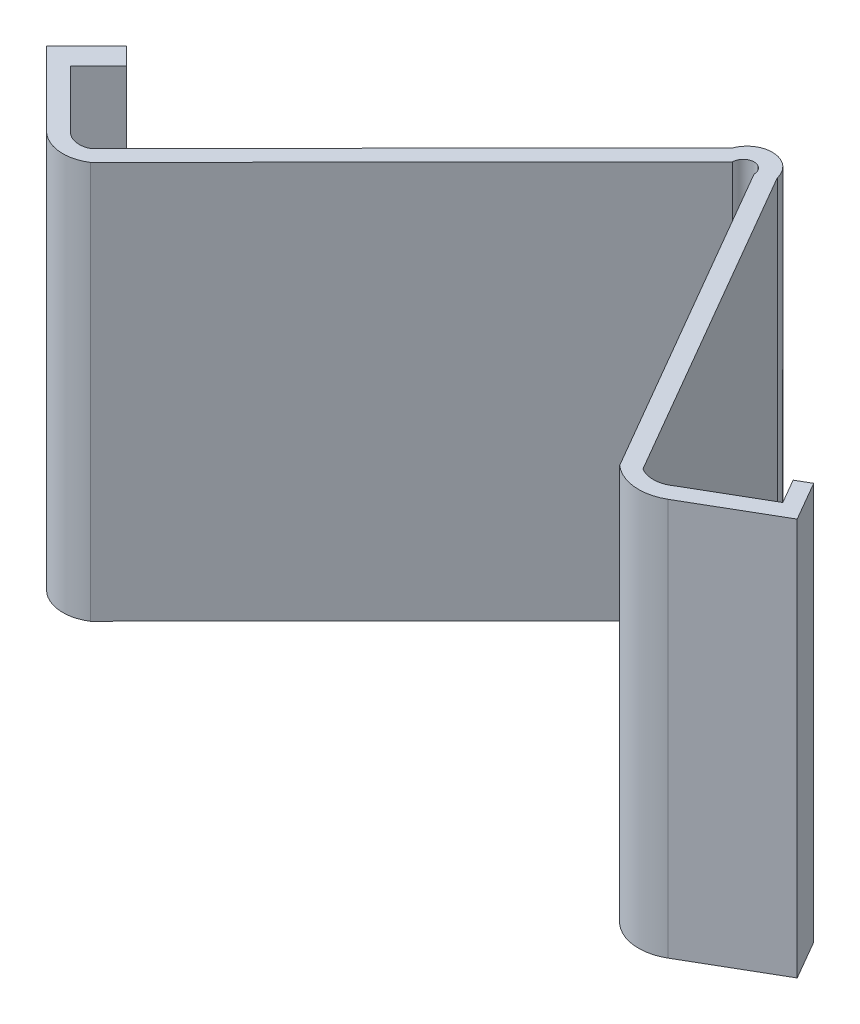
ISO-10303-21;
HEADER;
FILE_DESCRIPTION(('STEP AP214'),'2;1');
FILE_NAME('part.step','',(''),(''),'','','');
FILE_SCHEMA(('AUTOMOTIVE_DESIGN { 1 0 10303 214 1 1 1 1 }'));
ENDSEC;
DATA;
#1=APPLICATION_CONTEXT('core data for automotive mechanical design processes');
#2=APPLICATION_PROTOCOL_DEFINITION('international standard','automotive_design',2000,#1);
#3=PRODUCT_CONTEXT('',#1,'mechanical');
#4=PRODUCT('Part','Part','',(#3));
#5=PRODUCT_RELATED_PRODUCT_CATEGORY('part','',(#4));
#6=PRODUCT_DEFINITION_FORMATION('','',#4);
#7=PRODUCT_DEFINITION_CONTEXT('part definition',#1,'design');
#8=PRODUCT_DEFINITION('design','',#6,#7);
#9=PRODUCT_DEFINITION_SHAPE('','',#8);
#10=(LENGTH_UNIT() NAMED_UNIT(*) SI_UNIT(.MILLI.,.METRE.));
#11=(NAMED_UNIT(*) PLANE_ANGLE_UNIT() SI_UNIT($,.RADIAN.));
#12=(NAMED_UNIT(*) SI_UNIT($,.STERADIAN.) SOLID_ANGLE_UNIT());
#13=UNCERTAINTY_MEASURE_WITH_UNIT(LENGTH_MEASURE(1.E-05),#10,'distance_accuracy_value','');
#14=(GEOMETRIC_REPRESENTATION_CONTEXT(3) GLOBAL_UNCERTAINTY_ASSIGNED_CONTEXT((#13)) GLOBAL_UNIT_ASSIGNED_CONTEXT((#10,
#11,#12)) REPRESENTATION_CONTEXT('',''));
#15=CARTESIAN_POINT('',(0.,0.,0.));
#16=DIRECTION('',(0.,0.,1.));
#17=DIRECTION('',(1.,0.,0.));
#18=AXIS2_PLACEMENT_3D('',#15,#16,#17);
#19=CARTESIAN_POINT('',(-1.37972752963532,70.,-1.37563338266311));
#20=DIRECTION('',(-0.708156678158469,0.,-0.7060553230304));
#21=DIRECTION('',(-0.7060553230304,0.,0.708156678158469));
#22=AXIS2_PLACEMENT_3D('',#19,#20,#21);
#23=PLANE('',#22);
#24=DIRECTION('',(0.7060553230304,0.,-0.708156678158469));
#25=VECTOR('',#24,1.);
#26=CARTESIAN_POINT('',(-1.37972752963532,0.,-1.37563338266311));
#27=LINE('',#26,#25);
#28=CARTESIAN_POINT('',(-43.3633685392197,0.,40.73295893945));
#29=VERTEX_POINT('',#28);
#30=CARTESIAN_POINT('',(13.1210573032123,0.,-15.9195753132276));
#31=VERTEX_POINT('',#30);
#32=EDGE_CURVE('E578',#29,#31,#27,.T.);
#33=ORIENTED_EDGE('',*,*,#32,.T.);
#34=DIRECTION('',(0.,-1.,0.));
#35=VECTOR('',#34,1.);
#36=CARTESIAN_POINT('',(13.1210573032123,70.,-15.9195753132276));
#37=LINE('',#36,#35);
#38=CARTESIAN_POINT('',(13.1210573032123,70.,-15.9195753132276));
#39=VERTEX_POINT('',#38);
#40=EDGE_CURVE('E598',#39,#31,#37,.T.);
#41=ORIENTED_EDGE('',*,*,#40,.F.);
#42=DIRECTION('',(0.7060553230304,0.,-0.708156678158469));
#43=VECTOR('',#42,1.);
#44=CARTESIAN_POINT('',(-1.37972752963532,70.,-1.37563338266311));
#45=LINE('',#44,#43);
#46=CARTESIAN_POINT('',(-43.3633685392197,70.,40.73295893945));
#47=VERTEX_POINT('',#46);
#48=EDGE_CURVE('E587',#47,#39,#45,.T.);
#49=ORIENTED_EDGE('',*,*,#48,.F.);
#50=DIRECTION('',(0.,-1.,0.));
#51=VECTOR('',#50,1.);
#52=CARTESIAN_POINT('',(-43.3633685392197,70.,40.73295893945));
#53=LINE('',#52,#51);
#54=EDGE_CURVE('E330',#47,#29,#53,.T.);
#55=ORIENTED_EDGE('',*,*,#54,.T.);
#56=EDGE_LOOP('',(#33,#41,#49,#55));
#57=FACE_BOUND('',#56,.T.);
#58=ADVANCED_FACE('F311',(#57),#23,.F.);
#59=CARTESIAN_POINT('',(-3.50419756411074,70.,-3.49379935175431));
#60=DIRECTION('',(-0.708156678158469,0.,-0.7060553230304));
#61=DIRECTION('',(-0.7060553230304,0.,0.708156678158469));
#62=AXIS2_PLACEMENT_3D('',#59,#60,#61);
#63=PLANE('',#62);
#64=DIRECTION('',(0.7060553230304,0.,-0.708156678158469));
#65=VECTOR('',#64,1.);
#66=CARTESIAN_POINT('',(-3.50419756411074,0.,-3.49379935175431));
#67=LINE('',#66,#65);
#68=CARTESIAN_POINT('',(-45.4878385736951,0.,38.6147929703588));
#69=VERTEX_POINT('',#68);
#70=CARTESIAN_POINT('',(10.9965872687369,0.,-18.0377412823188));
#71=VERTEX_POINT('',#70);
#72=EDGE_CURVE('E576',#69,#71,#67,.T.);
#73=ORIENTED_EDGE('',*,*,#72,.F.);
#74=DIRECTION('',(0.,-1.,0.));
#75=VECTOR('',#74,1.);
#76=CARTESIAN_POINT('',(-45.4878385736951,70.,38.6147929703588));
#77=LINE('',#76,#75);
#78=CARTESIAN_POINT('',(-45.4878385736951,70.,38.6147929703588));
#79=VERTEX_POINT('',#78);
#80=EDGE_CURVE('E321',#79,#69,#77,.T.);
#81=ORIENTED_EDGE('',*,*,#80,.F.);
#82=DIRECTION('',(0.7060553230304,0.,-0.708156678158469));
#83=VECTOR('',#82,1.);
#84=CARTESIAN_POINT('',(-3.50419756411074,70.,-3.49379935175431));
#85=LINE('',#84,#83);
#86=CARTESIAN_POINT('',(10.9965872687369,70.,-18.0377412823188));
#87=VERTEX_POINT('',#86);
#88=EDGE_CURVE('E585',#79,#87,#85,.T.);
#89=ORIENTED_EDGE('',*,*,#88,.T.);
#90=DIRECTION('',(0.,-1.,0.));
#91=VECTOR('',#90,1.);
#92=CARTESIAN_POINT('',(10.9965872687369,70.,-18.0377412823188));
#93=LINE('',#92,#91);
#94=EDGE_CURVE('E12',#87,#71,#93,.T.);
#95=ORIENTED_EDGE('',*,*,#94,.T.);
#96=EDGE_LOOP('',(#73,#81,#89,#95));
#97=FACE_BOUND('',#96,.T.);
#98=ADVANCED_FACE('F653',(#97),#63,.T.);
#99=CARTESIAN_POINT('',(-47.1014105514273,70.,34.8767509581333));
#100=DIRECTION('',(0.,-1.,0.));
#101=DIRECTION('',(0.,0.,-1.));
#102=AXIS2_PLACEMENT_3D('',#99,#100,#101);
#103=CYLINDRICAL_SURFACE('',#102,6.94752689850618);
#104=CARTESIAN_POINT('',(-47.1014105514273,0.,34.8767509581333));
#105=DIRECTION('',(0.,1.,0.));
#106=DIRECTION('',(0.,0.,1.));
#107=AXIS2_PLACEMENT_3D('',#104,#105,#106);
#108=CIRCLE('',#107,6.94752689850618);
#109=CARTESIAN_POINT('',(-52.0067489000145,0.,39.7966885279961));
#110=VERTEX_POINT('',#109);
#111=EDGE_CURVE('E551',#29,#110,#108,.F.);
#112=ORIENTED_EDGE('',*,*,#111,.F.);
#113=ORIENTED_EDGE('',*,*,#54,.F.);
#114=CARTESIAN_POINT('',(-47.1014105514273,70.,34.8767509581333));
#115=DIRECTION('',(0.,1.,0.));
#116=DIRECTION('',(0.,0.,1.));
#117=AXIS2_PLACEMENT_3D('',#114,#115,#116);
#118=CIRCLE('',#117,6.94752689850618);
#119=CARTESIAN_POINT('',(-52.0067489000145,70.,39.7966885279961));
#120=VERTEX_POINT('',#119);
#121=EDGE_CURVE('E645',#47,#120,#118,.F.);
#122=ORIENTED_EDGE('',*,*,#121,.T.);
#123=DIRECTION('',(0.,-1.,0.));
#124=VECTOR('',#123,1.);
#125=CARTESIAN_POINT('',(-52.0067489000145,70.,39.7966885279961));
#126=LINE('',#125,#124);
#127=EDGE_CURVE('E556',#120,#110,#126,.T.);
#128=ORIENTED_EDGE('',*,*,#127,.T.);
#129=EDGE_LOOP('',(#112,#113,#122,#128));
#130=FACE_BOUND('',#129,.T.);
#131=ADVANCED_FACE('F683',(#130),#103,.T.);
#132=CARTESIAN_POINT('',(-47.0795581582017,70.,35.301794509272));
#133=DIRECTION('',(0.,-1.,0.));
#134=DIRECTION('',(0.,0.,-1.));
#135=AXIS2_PLACEMENT_3D('',#132,#133,#134);
#136=CYLINDRICAL_SURFACE('',#135,3.67553125940526);
#137=CARTESIAN_POINT('',(-47.0795581582017,0.,35.301794509272));
#138=DIRECTION('',(0.,1.,0.));
#139=DIRECTION('',(0.,0.,1.));
#140=AXIS2_PLACEMENT_3D('',#137,#138,#139);
#141=CIRCLE('',#140,3.67553125940526);
#142=CARTESIAN_POINT('',(-49.8885829309233,0.,37.6722184935206));
#143=VERTEX_POINT('',#142);
#144=EDGE_CURVE('E570',#143,#69,#141,.T.);
#145=ORIENTED_EDGE('',*,*,#144,.F.);
#146=DIRECTION('',(0.,-1.,0.));
#147=VECTOR('',#146,1.);
#148=CARTESIAN_POINT('',(-49.8885829309233,70.,37.6722184935206));
#149=LINE('',#148,#147);
#150=CARTESIAN_POINT('',(-49.8885829309233,70.,37.6722184935206));
#151=VERTEX_POINT('',#150);
#152=EDGE_CURVE('E567',#151,#143,#149,.T.);
#153=ORIENTED_EDGE('',*,*,#152,.F.);
#154=CARTESIAN_POINT('',(-47.0795581582017,70.,35.301794509272));
#155=DIRECTION('',(0.,1.,0.));
#156=DIRECTION('',(0.,0.,1.));
#157=AXIS2_PLACEMENT_3D('',#154,#155,#156);
#158=CIRCLE('',#157,3.67553125940526);
#159=EDGE_CURVE('E646',#151,#79,#158,.T.);
#160=ORIENTED_EDGE('',*,*,#159,.T.);
#161=ORIENTED_EDGE('',*,*,#80,.T.);
#162=EDGE_LOOP('',(#145,#153,#160,#161));
#163=FACE_BOUND('',#162,.T.);
#164=ADVANCED_FACE('F572',(#163),#136,.F.);
#165=CARTESIAN_POINT('',(0.,0.,0.));
#166=DIRECTION('',(0.,1.,0.));
#167=DIRECTION('',(0.,0.,1.));
#168=AXIS2_PLACEMENT_3D('',#165,#166,#167);
#169=PLANE('',#168);
#170=ORIENTED_EDGE('',*,*,#144,.T.);
#171=ORIENTED_EDGE('',*,*,#72,.T.);
#172=CARTESIAN_POINT('',(15.1528221863756,0.,-16.4480817857646));
#173=DIRECTION('',(0.,1.,0.));
#174=DIRECTION('',(0.,0.,1.));
#175=AXIS2_PLACEMENT_3D('',#172,#173,#174);
#176=CIRCLE('',#175,4.44986584130173);
#177=CARTESIAN_POINT('',(19.4944801510169,0.,-17.4234340932158));
#178=VERTEX_POINT('',#177);
#179=EDGE_CURVE('E595',#178,#71,#176,.T.);
#180=ORIENTED_EDGE('',*,*,#179,.F.);
#181=DIRECTION('',(0.501286259996058,0.,0.865281506527884));
#182=VECTOR('',#181,1.);
#183=CARTESIAN_POINT('',(22.1532324220866,0.,-12.83410190084));
#184=LINE('',#183,#182);
#185=CARTESIAN_POINT('',(52.0780870507607,0.,38.8198638310967));
#186=VERTEX_POINT('',#185);
#187=EDGE_CURVE('E613',#178,#186,#184,.T.);
#188=ORIENTED_EDGE('',*,*,#187,.T.);
#189=CARTESIAN_POINT('',(54.6049088930095,0.,34.700594649184));
#190=DIRECTION('',(0.,1.,0.));
#191=DIRECTION('',(0.,0.,1.));
#192=AXIS2_PLACEMENT_3D('',#189,#190,#191);
#193=CIRCLE('',#192,4.83251561979015);
#194=CARTESIAN_POINT('',(57.4000259774135,0.,38.6427422491584));
#195=VERTEX_POINT('',#194);
#196=EDGE_CURVE('E626',#186,#195,#193,.T.);
#197=ORIENTED_EDGE('',*,*,#196,.T.);
#198=DIRECTION('',(0.865281506527882,0.,-0.501286259996061));
#199=VECTOR('',#198,1.);
#200=CARTESIAN_POINT('',(57.4000259774135,0.,38.6427422491584));
#201=LINE('',#200,#199);
#202=CARTESIAN_POINT('',(69.5139670688039,0.,31.6247346092136));
#203=VERTEX_POINT('',#202);
#204=EDGE_CURVE('E456',#195,#203,#201,.T.);
#205=ORIENTED_EDGE('',*,*,#204,.T.);
#206=DIRECTION('',(-0.501286259996063,0.,-0.865281506527881));
#207=VECTOR('',#206,1.);
#208=CARTESIAN_POINT('',(71.0178258487921,0.,34.2205791287972));
#209=LINE('',#208,#207);
#210=CARTESIAN_POINT('',(67.0075357688236,0.,27.2983270765742));
#211=VERTEX_POINT('',#210);
#212=EDGE_CURVE('E440',#203,#211,#209,.T.);
#213=ORIENTED_EDGE('',*,*,#212,.T.);
#214=DIRECTION('',(0.865281506527881,0.,-0.501286259996062));
#215=VECTOR('',#214,1.);
#216=CARTESIAN_POINT('',(67.0075357688236,0.,27.2983270765742));
#217=LINE('',#216,#215);
#218=CARTESIAN_POINT('',(69.3043788078117,0.,25.9676897659115));
#219=VERTEX_POINT('',#218);
#220=EDGE_CURVE('E470',#211,#219,#217,.T.);
#221=ORIENTED_EDGE('',*,*,#220,.T.);
#222=DIRECTION('',(-0.501286259996063,0.,-0.865281506527881));
#223=VECTOR('',#222,1.);
#224=CARTESIAN_POINT('',(73.3146688877803,0.,32.8899418181347));
#225=LINE('',#224,#223);
#226=CARTESIAN_POINT('',(73.3146688877803,0.,32.8899418181347));
#227=VERTEX_POINT('',#226);
#228=EDGE_CURVE('E462',#227,#219,#225,.T.);
#229=ORIENTED_EDGE('',*,*,#228,.F.);
#230=DIRECTION('',(0.865281506527882,0.,-0.501286259996062));
#231=VECTOR('',#230,1.);
#232=CARTESIAN_POINT('',(58.9038847574017,0.,41.2385867687421));
#233=LINE('',#232,#231);
#234=CARTESIAN_POINT('',(58.9038847574017,0.,41.2385867687421));
#235=VERTEX_POINT('',#234);
#236=EDGE_CURVE('E446',#235,#227,#233,.T.);
#237=ORIENTED_EDGE('',*,*,#236,.F.);
#238=CARTESIAN_POINT('',(54.8312610227236,0.,34.2087391908511));
#239=DIRECTION('',(0.,1.,0.));
#240=DIRECTION('',(0.,0.,1.));
#241=AXIS2_PLACEMENT_3D('',#238,#239,#240);
#242=CIRCLE('',#241,8.1243474231868);
#243=CARTESIAN_POINT('',(49.4822425311771,0.,40.3237226110849));
#244=VERTEX_POINT('',#243);
#245=EDGE_CURVE('E624',#244,#235,#242,.T.);
#246=ORIENTED_EDGE('',*,*,#245,.F.);
#247=DIRECTION('',(0.501286259996058,0.,0.865281506527884));
#248=VECTOR('',#247,1.);
#249=CARTESIAN_POINT('',(19.5573879025029,0.,-11.3302431208518));
#250=LINE('',#249,#248);
#251=CARTESIAN_POINT('',(16.8986356314333,0.,-15.9195753132276));
#252=VERTEX_POINT('',#251);
#253=EDGE_CURVE('E558',#252,#244,#250,.T.);
#254=ORIENTED_EDGE('',*,*,#253,.F.);
#255=CARTESIAN_POINT('',(15.0098464673228,0.,-15.9195753132276));
#256=DIRECTION('',(0.,1.,0.));
#257=DIRECTION('',(0.,0.,1.));
#258=AXIS2_PLACEMENT_3D('',#255,#256,#257);
#259=CIRCLE('',#258,1.88878916411049);
#260=EDGE_CURVE('E599',#252,#31,#259,.T.);
#261=ORIENTED_EDGE('',*,*,#260,.T.);
#262=ORIENTED_EDGE('',*,*,#32,.F.);
#263=ORIENTED_EDGE('',*,*,#111,.T.);
#264=DIRECTION('',(-0.708156678158472,0.,-0.706055323030397));
#265=VECTOR('',#264,1.);
#266=CARTESIAN_POINT('',(-52.0067489000145,0.,39.796688527996));
#267=LINE('',#266,#265);
#268=CARTESIAN_POINT('',(-64.9802774574749,0.,26.861657087917));
#269=VERTEX_POINT('',#268);
#270=EDGE_CURVE('E549',#110,#269,#267,.T.);
#271=ORIENTED_EDGE('',*,*,#270,.T.);
#272=DIRECTION('',(0.706055323030396,0.,-0.708156678158473));
#273=VECTOR('',#272,1.);
#274=CARTESIAN_POINT('',(-64.9802774574749,0.,26.861657087917));
#275=LINE('',#274,#273);
#276=CARTESIAN_POINT('',(-57.9197242271709,0.,19.7800903063323));
#277=VERTEX_POINT('',#276);
#278=EDGE_CURVE('E482',#269,#277,#275,.T.);
#279=ORIENTED_EDGE('',*,*,#278,.T.);
#280=DIRECTION('',(-0.708156678158471,0.,-0.706055323030398));
#281=VECTOR('',#280,1.);
#282=CARTESIAN_POINT('',(-54.8603891639291,0.,22.8303472239858));
#283=LINE('',#282,#281);
#284=CARTESIAN_POINT('',(-54.8603891639291,0.,22.8303472239858));
#285=VERTEX_POINT('',#284);
#286=EDGE_CURVE('E478',#285,#277,#283,.T.);
#287=ORIENTED_EDGE('',*,*,#286,.F.);
#288=DIRECTION('',(0.706055323030397,0.,-0.708156678158472));
#289=VECTOR('',#288,1.);
#290=CARTESIAN_POINT('',(-61.9209423942331,0.,29.9119140055705));
#291=LINE('',#290,#289);
#292=CARTESIAN_POINT('',(-59.8027764251419,0.,27.7874439710951));
#293=VERTEX_POINT('',#292);
#294=EDGE_CURVE('E489',#293,#285,#291,.T.);
#295=ORIENTED_EDGE('',*,*,#294,.F.);
#296=DIRECTION('',(-0.708156678158472,0.,-0.706055323030397));
#297=VECTOR('',#296,1.);
#298=CARTESIAN_POINT('',(-49.8885829309233,0.,37.6722184935206));
#299=LINE('',#298,#297);
#300=EDGE_CURVE('E528',#143,#293,#299,.T.);
#301=ORIENTED_EDGE('',*,*,#300,.F.);
#302=EDGE_LOOP('',(#170,#171,#180,#188,#197,#205,#213,#221,#229,#237,#246,#254,#261,#262,#263,
#271,#279,#287,#295,#301));
#303=FACE_BOUND('',#302,.T.);
#304=ADVANCED_FACE('F468',(#303),#169,.F.);
#305=CARTESIAN_POINT('',(0.,70.,0.));
#306=DIRECTION('',(0.,1.,0.));
#307=DIRECTION('',(0.,0.,1.));
#308=AXIS2_PLACEMENT_3D('',#305,#306,#307);
#309=PLANE('',#308);
#310=ORIENTED_EDGE('',*,*,#121,.F.);
#311=ORIENTED_EDGE('',*,*,#48,.T.);
#312=CARTESIAN_POINT('',(15.0098464673228,70.,-15.9195753132276));
#313=DIRECTION('',(0.,1.,0.));
#314=DIRECTION('',(0.,0.,1.));
#315=AXIS2_PLACEMENT_3D('',#312,#313,#314);
#316=CIRCLE('',#315,1.88878916411049);
#317=CARTESIAN_POINT('',(16.8986356314333,70.,-15.9195753132276));
#318=VERTEX_POINT('',#317);
#319=EDGE_CURVE('E591',#318,#39,#316,.T.);
#320=ORIENTED_EDGE('',*,*,#319,.F.);
#321=DIRECTION('',(0.501286259996058,0.,0.865281506527884));
#322=VECTOR('',#321,1.);
#323=CARTESIAN_POINT('',(19.5573879025029,70.,-11.3302431208518));
#324=LINE('',#323,#322);
#325=CARTESIAN_POINT('',(49.4822425311771,70.,40.3237226110849));
#326=VERTEX_POINT('',#325);
#327=EDGE_CURVE('E611',#318,#326,#324,.T.);
#328=ORIENTED_EDGE('',*,*,#327,.T.);
#329=CARTESIAN_POINT('',(54.8312610227236,70.,34.2087391908511));
#330=DIRECTION('',(0.,1.,0.));
#331=DIRECTION('',(0.,0.,1.));
#332=AXIS2_PLACEMENT_3D('',#329,#330,#331);
#333=CIRCLE('',#332,8.1243474231868);
#334=CARTESIAN_POINT('',(58.9038847574017,70.,41.2385867687421));
#335=VERTEX_POINT('',#334);
#336=EDGE_CURVE('E518',#326,#335,#333,.T.);
#337=ORIENTED_EDGE('',*,*,#336,.T.);
#338=DIRECTION('',(0.865281506527882,0.,-0.501286259996062));
#339=VECTOR('',#338,1.);
#340=CARTESIAN_POINT('',(58.9038847574017,70.,41.2385867687421));
#341=LINE('',#340,#339);
#342=CARTESIAN_POINT('',(73.3146688877803,70.,32.8899418181347));
#343=VERTEX_POINT('',#342);
#344=EDGE_CURVE('E515',#335,#343,#341,.T.);
#345=ORIENTED_EDGE('',*,*,#344,.T.);
#346=DIRECTION('',(-0.501286259996063,0.,-0.865281506527881));
#347=VECTOR('',#346,1.);
#348=CARTESIAN_POINT('',(73.3146688877803,70.,32.8899418181347));
#349=LINE('',#348,#347);
#350=CARTESIAN_POINT('',(69.3043788078117,70.,25.9676897659115));
#351=VERTEX_POINT('',#350);
#352=EDGE_CURVE('E463',#343,#351,#349,.T.);
#353=ORIENTED_EDGE('',*,*,#352,.T.);
#354=DIRECTION('',(0.865281506527881,0.,-0.501286259996062));
#355=VECTOR('',#354,1.);
#356=CARTESIAN_POINT('',(67.0075357688236,70.,27.2983270765742));
#357=LINE('',#356,#355);
#358=CARTESIAN_POINT('',(67.0075357688236,70.,27.2983270765742));
#359=VERTEX_POINT('',#358);
#360=EDGE_CURVE('E503',#359,#351,#357,.T.);
#361=ORIENTED_EDGE('',*,*,#360,.F.);
#362=DIRECTION('',(-0.501286259996063,0.,-0.865281506527881));
#363=VECTOR('',#362,1.);
#364=CARTESIAN_POINT('',(71.0178258487921,70.,34.2205791287972));
#365=LINE('',#364,#363);
#366=CARTESIAN_POINT('',(69.5139670688039,70.,31.6247346092136));
#367=VERTEX_POINT('',#366);
#368=EDGE_CURVE('E465',#367,#359,#365,.T.);
#369=ORIENTED_EDGE('',*,*,#368,.F.);
#370=DIRECTION('',(0.865281506527882,0.,-0.501286259996061));
#371=VECTOR('',#370,1.);
#372=CARTESIAN_POINT('',(57.4000259774135,70.,38.6427422491584));
#373=LINE('',#372,#371);
#374=CARTESIAN_POINT('',(57.4000259774135,70.,38.6427422491584));
#375=VERTEX_POINT('',#374);
#376=EDGE_CURVE('E519',#375,#367,#373,.T.);
#377=ORIENTED_EDGE('',*,*,#376,.F.);
#378=CARTESIAN_POINT('',(54.6049088930095,70.,34.700594649184));
#379=DIRECTION('',(0.,1.,0.));
#380=DIRECTION('',(0.,0.,1.));
#381=AXIS2_PLACEMENT_3D('',#378,#379,#380);
#382=CIRCLE('',#381,4.83251561979015);
#383=CARTESIAN_POINT('',(52.0780870507607,70.,38.8198638310967));
#384=VERTEX_POINT('',#383);
#385=EDGE_CURVE('E615',#384,#375,#382,.T.);
#386=ORIENTED_EDGE('',*,*,#385,.F.);
#387=DIRECTION('',(0.501286259996058,0.,0.865281506527884));
#388=VECTOR('',#387,1.);
#389=CARTESIAN_POINT('',(22.1532324220866,70.,-12.83410190084));
#390=LINE('',#389,#388);
#391=CARTESIAN_POINT('',(19.4944801510169,70.,-17.4234340932158));
#392=VERTEX_POINT('',#391);
#393=EDGE_CURVE('E618',#392,#384,#390,.T.);
#394=ORIENTED_EDGE('',*,*,#393,.F.);
#395=CARTESIAN_POINT('',(15.1528221863756,70.,-16.4480817857646));
#396=DIRECTION('',(0.,1.,0.));
#397=DIRECTION('',(0.,0.,1.));
#398=AXIS2_PLACEMENT_3D('',#395,#396,#397);
#399=CIRCLE('',#398,4.44986584130173);
#400=EDGE_CURVE('E594',#392,#87,#399,.T.);
#401=ORIENTED_EDGE('',*,*,#400,.T.);
#402=ORIENTED_EDGE('',*,*,#88,.F.);
#403=ORIENTED_EDGE('',*,*,#159,.F.);
#404=DIRECTION('',(-0.708156678158472,0.,-0.706055323030397));
#405=VECTOR('',#404,1.);
#406=CARTESIAN_POINT('',(-49.8885829309233,70.,37.6722184935206));
#407=LINE('',#406,#405);
#408=CARTESIAN_POINT('',(-59.8027764251419,70.,27.7874439710951));
#409=VERTEX_POINT('',#408);
#410=EDGE_CURVE('E540',#151,#409,#407,.T.);
#411=ORIENTED_EDGE('',*,*,#410,.T.);
#412=DIRECTION('',(0.706055323030397,0.,-0.708156678158472));
#413=VECTOR('',#412,1.);
#414=CARTESIAN_POINT('',(-61.9209423942331,70.,29.9119140055705));
#415=LINE('',#414,#413);
#416=CARTESIAN_POINT('',(-54.8603891639291,70.,22.8303472239858));
#417=VERTEX_POINT('',#416);
#418=EDGE_CURVE('E492',#409,#417,#415,.T.);
#419=ORIENTED_EDGE('',*,*,#418,.T.);
#420=DIRECTION('',(-0.708156678158471,0.,-0.706055323030398));
#421=VECTOR('',#420,1.);
#422=CARTESIAN_POINT('',(-54.8603891639291,70.,22.8303472239858));
#423=LINE('',#422,#421);
#424=CARTESIAN_POINT('',(-57.9197242271709,70.,19.7800903063323));
#425=VERTEX_POINT('',#424);
#426=EDGE_CURVE('E496',#417,#425,#423,.T.);
#427=ORIENTED_EDGE('',*,*,#426,.T.);
#428=DIRECTION('',(0.706055323030396,0.,-0.708156678158473));
#429=VECTOR('',#428,1.);
#430=CARTESIAN_POINT('',(-64.9802774574749,70.,26.861657087917));
#431=LINE('',#430,#429);
#432=CARTESIAN_POINT('',(-64.9802774574749,70.,26.861657087917));
#433=VERTEX_POINT('',#432);
#434=EDGE_CURVE('E529',#433,#425,#431,.T.);
#435=ORIENTED_EDGE('',*,*,#434,.F.);
#436=DIRECTION('',(-0.708156678158472,0.,-0.706055323030397));
#437=VECTOR('',#436,1.);
#438=CARTESIAN_POINT('',(-52.0067489000145,70.,39.796688527996));
#439=LINE('',#438,#437);
#440=EDGE_CURVE('E555',#120,#433,#439,.T.);
#441=ORIENTED_EDGE('',*,*,#440,.F.);
#442=EDGE_LOOP('',(#310,#311,#320,#328,#337,#345,#353,#361,#369,#377,#386,#394,#401,#402,#403,
#411,#419,#427,#435,#441));
#443=FACE_BOUND('',#442,.T.);
#444=ADVANCED_FACE('F513',(#443),#309,.T.);
#445=CARTESIAN_POINT('',(-64.9802774574749,70.,26.861657087917));
#446=DIRECTION('',(-0.708156678158473,0.,-0.706055323030396));
#447=DIRECTION('',(-0.706055323030396,0.,0.708156678158473));
#448=AXIS2_PLACEMENT_3D('',#445,#446,#447);
#449=PLANE('',#448);
#450=ORIENTED_EDGE('',*,*,#278,.F.);
#451=DIRECTION('',(0.,-1.,0.));
#452=VECTOR('',#451,1.);
#453=CARTESIAN_POINT('',(-64.9802774574749,70.,26.861657087917));
#454=LINE('',#453,#452);
#455=EDGE_CURVE('E499',#433,#269,#454,.T.);
#456=ORIENTED_EDGE('',*,*,#455,.F.);
#457=ORIENTED_EDGE('',*,*,#434,.T.);
#458=DIRECTION('',(0.,-1.,0.));
#459=VECTOR('',#458,1.);
#460=CARTESIAN_POINT('',(-57.9197242271709,70.,19.7800903063323));
#461=LINE('',#460,#459);
#462=EDGE_CURVE('E457',#425,#277,#461,.T.);
#463=ORIENTED_EDGE('',*,*,#462,.T.);
#464=EDGE_LOOP('',(#450,#456,#457,#463));
#465=FACE_BOUND('',#464,.T.);
#466=ADVANCED_FACE('F546',(#465),#449,.T.);
#467=CARTESIAN_POINT('',(-54.8603891639291,70.,22.8303472239858));
#468=DIRECTION('',(-0.706055323030398,0.,0.708156678158471));
#469=DIRECTION('',(0.708156678158471,0.,0.706055323030398));
#470=AXIS2_PLACEMENT_3D('',#467,#468,#469);
#471=PLANE('',#470);
#472=ORIENTED_EDGE('',*,*,#286,.T.);
#473=ORIENTED_EDGE('',*,*,#462,.F.);
#474=ORIENTED_EDGE('',*,*,#426,.F.);
#475=DIRECTION('',(0.,-1.,0.));
#476=VECTOR('',#475,1.);
#477=CARTESIAN_POINT('',(-54.8603891639291,70.,22.8303472239858));
#478=LINE('',#477,#476);
#479=EDGE_CURVE('E497',#417,#285,#478,.T.);
#480=ORIENTED_EDGE('',*,*,#479,.T.);
#481=EDGE_LOOP('',(#472,#473,#474,#480));
#482=FACE_BOUND('',#481,.T.);
#483=ADVANCED_FACE('F544',(#482),#471,.F.);
#484=CARTESIAN_POINT('',(-61.9209423942331,70.,29.9119140055705));
#485=DIRECTION('',(-0.708156678158472,0.,-0.706055323030397));
#486=DIRECTION('',(-0.706055323030397,0.,0.708156678158472));
#487=AXIS2_PLACEMENT_3D('',#484,#485,#486);
#488=PLANE('',#487);
#489=ORIENTED_EDGE('',*,*,#418,.F.);
#490=DIRECTION('',(0.,-1.,0.));
#491=VECTOR('',#490,1.);
#492=CARTESIAN_POINT('',(-59.8027764251419,70.,27.7874439710951));
#493=LINE('',#492,#491);
#494=EDGE_CURVE('E524',#409,#293,#493,.T.);
#495=ORIENTED_EDGE('',*,*,#494,.T.);
#496=ORIENTED_EDGE('',*,*,#294,.T.);
#497=ORIENTED_EDGE('',*,*,#479,.F.);
#498=EDGE_LOOP('',(#489,#495,#496,#497));
#499=FACE_BOUND('',#498,.T.);
#500=ADVANCED_FACE('F542',(#499),#488,.F.);
#501=CARTESIAN_POINT('',(-52.0067489000145,70.,39.796688527996));
#502=DIRECTION('',(-0.706055323030397,0.,0.708156678158472));
#503=DIRECTION('',(0.708156678158472,0.,0.706055323030397));
#504=AXIS2_PLACEMENT_3D('',#501,#502,#503);
#505=PLANE('',#504);
#506=ORIENTED_EDGE('',*,*,#270,.F.);
#507=ORIENTED_EDGE('',*,*,#127,.F.);
#508=ORIENTED_EDGE('',*,*,#440,.T.);
#509=ORIENTED_EDGE('',*,*,#455,.T.);
#510=EDGE_LOOP('',(#506,#507,#508,#509));
#511=FACE_BOUND('',#510,.T.);
#512=ADVANCED_FACE('F553',(#511),#505,.T.);
#513=CARTESIAN_POINT('',(-49.8885829309233,70.,37.6722184935206));
#514=DIRECTION('',(-0.706055323030397,0.,0.708156678158472));
#515=DIRECTION('',(0.708156678158472,0.,0.706055323030397));
#516=AXIS2_PLACEMENT_3D('',#513,#514,#515);
#517=PLANE('',#516);
#518=ORIENTED_EDGE('',*,*,#300,.T.);
#519=ORIENTED_EDGE('',*,*,#494,.F.);
#520=ORIENTED_EDGE('',*,*,#410,.F.);
#521=ORIENTED_EDGE('',*,*,#152,.T.);
#522=EDGE_LOOP('',(#518,#519,#520,#521));
#523=FACE_BOUND('',#522,.T.);
#524=ADVANCED_FACE('F565',(#523),#517,.F.);
#525=CARTESIAN_POINT('',(73.3146688877803,70.,32.8899418181347));
#526=DIRECTION('',(-0.865281506527881,0.,0.501286259996063));
#527=DIRECTION('',(0.501286259996063,0.,0.865281506527881));
#528=AXIS2_PLACEMENT_3D('',#525,#526,#527);
#529=PLANE('',#528);
#530=ORIENTED_EDGE('',*,*,#228,.T.);
#531=DIRECTION('',(0.,-1.,0.));
#532=VECTOR('',#531,1.);
#533=CARTESIAN_POINT('',(69.3043788078117,70.,25.9676897659115));
#534=LINE('',#533,#532);
#535=EDGE_CURVE('E315',#351,#219,#534,.T.);
#536=ORIENTED_EDGE('',*,*,#535,.F.);
#537=ORIENTED_EDGE('',*,*,#352,.F.);
#538=DIRECTION('',(0.,-1.,0.));
#539=VECTOR('',#538,1.);
#540=CARTESIAN_POINT('',(73.3146688877803,70.,32.8899418181347));
#541=LINE('',#540,#539);
#542=EDGE_CURVE('E450',#343,#227,#541,.T.);
#543=ORIENTED_EDGE('',*,*,#542,.T.);
#544=EDGE_LOOP('',(#530,#536,#537,#543));
#545=FACE_BOUND('',#544,.T.);
#546=ADVANCED_FACE('F313',(#545),#529,.F.);
#547=CARTESIAN_POINT('',(71.0178258487921,70.,34.2205791287972));
#548=DIRECTION('',(-0.501286259996034,0.,-0.865281506527898));
#549=DIRECTION('',(-0.865281506527898,0.,0.501286259996034));
#550=AXIS2_PLACEMENT_3D('',#547,#548,#549);
#551=PLANE('',#550);
#552=ORIENTED_EDGE('',*,*,#236,.T.);
#553=ORIENTED_EDGE('',*,*,#542,.F.);
#554=ORIENTED_EDGE('',*,*,#344,.F.);
#555=DIRECTION('',(0.,-1.,0.));
#556=VECTOR('',#555,1.);
#557=CARTESIAN_POINT('',(58.9038847574017,70.,41.2385867687421));
#558=LINE('',#557,#556);
#559=EDGE_CURVE('E452',#335,#235,#558,.T.);
#560=ORIENTED_EDGE('',*,*,#559,.T.);
#561=EDGE_LOOP('',(#552,#553,#554,#560));
#562=FACE_BOUND('',#561,.T.);
#563=ADVANCED_FACE('F448',(#562),#551,.F.);
#564=CARTESIAN_POINT('',(67.0075357688236,70.,27.2983270765742));
#565=DIRECTION('',(-0.501286259996062,0.,-0.865281506527881));
#566=DIRECTION('',(-0.865281506527881,0.,0.501286259996062));
#567=AXIS2_PLACEMENT_3D('',#564,#565,#566);
#568=PLANE('',#567);
#569=ORIENTED_EDGE('',*,*,#220,.F.);
#570=DIRECTION('',(0.,-1.,0.));
#571=VECTOR('',#570,1.);
#572=CARTESIAN_POINT('',(67.0075357688236,70.,27.2983270765742));
#573=LINE('',#572,#571);
#574=EDGE_CURVE('E464',#359,#211,#573,.T.);
#575=ORIENTED_EDGE('',*,*,#574,.F.);
#576=ORIENTED_EDGE('',*,*,#360,.T.);
#577=ORIENTED_EDGE('',*,*,#535,.T.);
#578=EDGE_LOOP('',(#569,#575,#576,#577));
#579=FACE_BOUND('',#578,.T.);
#580=ADVANCED_FACE('F511',(#579),#568,.T.);
#581=CARTESIAN_POINT('',(71.0178258487921,70.,34.2205791287972));
#582=DIRECTION('',(-0.865281506527881,0.,0.501286259996063));
#583=DIRECTION('',(0.501286259996063,0.,0.865281506527881));
#584=AXIS2_PLACEMENT_3D('',#581,#582,#583);
#585=PLANE('',#584);
#586=ORIENTED_EDGE('',*,*,#212,.F.);
#587=DIRECTION('',(0.,-1.,0.));
#588=VECTOR('',#587,1.);
#589=CARTESIAN_POINT('',(69.5139670688039,70.,31.6247346092136));
#590=LINE('',#589,#588);
#591=EDGE_CURVE('E507',#367,#203,#590,.T.);
#592=ORIENTED_EDGE('',*,*,#591,.F.);
#593=ORIENTED_EDGE('',*,*,#368,.T.);
#594=ORIENTED_EDGE('',*,*,#574,.T.);
#595=EDGE_LOOP('',(#586,#592,#593,#594));
#596=FACE_BOUND('',#595,.T.);
#597=ADVANCED_FACE('F506',(#596),#585,.T.);
#598=CARTESIAN_POINT('',(54.8312610227236,70.,34.2087391908511));
#599=DIRECTION('',(0.,-1.,0.));
#600=DIRECTION('',(0.,0.,-1.));
#601=AXIS2_PLACEMENT_3D('',#598,#599,#600);
#602=CYLINDRICAL_SURFACE('',#601,8.1243474231868);
#603=ORIENTED_EDGE('',*,*,#245,.T.);
#604=ORIENTED_EDGE('',*,*,#559,.F.);
#605=ORIENTED_EDGE('',*,*,#336,.F.);
#606=DIRECTION('',(0.,-1.,0.));
#607=VECTOR('',#606,1.);
#608=CARTESIAN_POINT('',(49.4822425311771,70.,40.3237226110849));
#609=LINE('',#608,#607);
#610=EDGE_CURVE('E602',#326,#244,#609,.T.);
#611=ORIENTED_EDGE('',*,*,#610,.T.);
#612=EDGE_LOOP('',(#603,#604,#605,#611));
#613=FACE_BOUND('',#612,.T.);
#614=ADVANCED_FACE('F635',(#613),#602,.T.);
#615=CARTESIAN_POINT('',(57.4000259774135,70.,38.6427422491584));
#616=DIRECTION('',(-0.501286259996061,0.,-0.865281506527882));
#617=DIRECTION('',(-0.865281506527882,0.,0.501286259996061));
#618=AXIS2_PLACEMENT_3D('',#615,#616,#617);
#619=PLANE('',#618);
#620=ORIENTED_EDGE('',*,*,#204,.F.);
#621=DIRECTION('',(0.,-1.,0.));
#622=VECTOR('',#621,1.);
#623=CARTESIAN_POINT('',(57.4000259774135,70.,38.6427422491584));
#624=LINE('',#623,#622);
#625=EDGE_CURVE('E632',#375,#195,#624,.T.);
#626=ORIENTED_EDGE('',*,*,#625,.F.);
#627=ORIENTED_EDGE('',*,*,#376,.T.);
#628=ORIENTED_EDGE('',*,*,#591,.T.);
#629=EDGE_LOOP('',(#620,#626,#627,#628));
#630=FACE_BOUND('',#629,.T.);
#631=ADVANCED_FACE('F672',(#630),#619,.T.);
#632=CARTESIAN_POINT('',(19.5573879025029,70.,-11.3302431208518));
#633=DIRECTION('',(0.865281506527884,0.,-0.501286259996058));
#634=DIRECTION('',(-0.501286259996058,0.,-0.865281506527884));
#635=AXIS2_PLACEMENT_3D('',#632,#633,#634);
#636=PLANE('',#635);
#637=ORIENTED_EDGE('',*,*,#253,.T.);
#638=ORIENTED_EDGE('',*,*,#610,.F.);
#639=ORIENTED_EDGE('',*,*,#327,.F.);
#640=DIRECTION('',(0.,-1.,0.));
#641=VECTOR('',#640,1.);
#642=CARTESIAN_POINT('',(16.8986356314333,70.,-15.9195753132276));
#643=LINE('',#642,#641);
#644=EDGE_CURVE('E580',#318,#252,#643,.T.);
#645=ORIENTED_EDGE('',*,*,#644,.T.);
#646=EDGE_LOOP('',(#637,#638,#639,#645));
#647=FACE_BOUND('',#646,.T.);
#648=ADVANCED_FACE('F637',(#647),#636,.F.);
#649=CARTESIAN_POINT('',(54.6049088930095,70.,34.700594649184));
#650=DIRECTION('',(0.,-1.,0.));
#651=DIRECTION('',(0.,0.,-1.));
#652=AXIS2_PLACEMENT_3D('',#649,#650,#651);
#653=CYLINDRICAL_SURFACE('',#652,4.83251561979015);
#654=ORIENTED_EDGE('',*,*,#196,.F.);
#655=DIRECTION('',(0.,-1.,0.));
#656=VECTOR('',#655,1.);
#657=CARTESIAN_POINT('',(52.0780870507607,70.,38.8198638310967));
#658=LINE('',#657,#656);
#659=EDGE_CURVE('E621',#384,#186,#658,.T.);
#660=ORIENTED_EDGE('',*,*,#659,.F.);
#661=ORIENTED_EDGE('',*,*,#385,.T.);
#662=ORIENTED_EDGE('',*,*,#625,.T.);
#663=EDGE_LOOP('',(#654,#660,#661,#662));
#664=FACE_BOUND('',#663,.T.);
#665=ADVANCED_FACE('F669',(#664),#653,.F.);
#666=CARTESIAN_POINT('',(22.1532324220866,70.,-12.83410190084));
#667=DIRECTION('',(0.865281506527884,0.,-0.501286259996058));
#668=DIRECTION('',(-0.501286259996058,0.,-0.865281506527884));
#669=AXIS2_PLACEMENT_3D('',#666,#667,#668);
#670=PLANE('',#669);
#671=ORIENTED_EDGE('',*,*,#187,.F.);
#672=DIRECTION('',(0.,-1.,0.));
#673=VECTOR('',#672,1.);
#674=CARTESIAN_POINT('',(19.4944801510169,70.,-17.4234340932158));
#675=LINE('',#674,#673);
#676=EDGE_CURVE('E607',#392,#178,#675,.T.);
#677=ORIENTED_EDGE('',*,*,#676,.F.);
#678=ORIENTED_EDGE('',*,*,#393,.T.);
#679=ORIENTED_EDGE('',*,*,#659,.T.);
#680=EDGE_LOOP('',(#671,#677,#678,#679));
#681=FACE_BOUND('',#680,.T.);
#682=ADVANCED_FACE('F667',(#681),#670,.T.);
#683=CARTESIAN_POINT('',(15.0098464673228,70.,-15.9195753132276));
#684=DIRECTION('',(0.,-1.,0.));
#685=DIRECTION('',(0.,0.,-1.));
#686=AXIS2_PLACEMENT_3D('',#683,#684,#685);
#687=CYLINDRICAL_SURFACE('',#686,1.88878916411049);
#688=ORIENTED_EDGE('',*,*,#260,.F.);
#689=ORIENTED_EDGE('',*,*,#644,.F.);
#690=ORIENTED_EDGE('',*,*,#319,.T.);
#691=ORIENTED_EDGE('',*,*,#40,.T.);
#692=EDGE_LOOP('',(#688,#689,#690,#691));
#693=FACE_BOUND('',#692,.T.);
#694=ADVANCED_FACE('F641',(#693),#687,.F.);
#695=CARTESIAN_POINT('',(15.1528221863756,70.,-16.4480817857646));
#696=DIRECTION('',(0.,-1.,0.));
#697=DIRECTION('',(0.,0.,-1.));
#698=AXIS2_PLACEMENT_3D('',#695,#696,#697);
#699=CYLINDRICAL_SURFACE('',#698,4.44986584130173);
#700=ORIENTED_EDGE('',*,*,#179,.T.);
#701=ORIENTED_EDGE('',*,*,#94,.F.);
#702=ORIENTED_EDGE('',*,*,#400,.F.);
#703=ORIENTED_EDGE('',*,*,#676,.T.);
#704=EDGE_LOOP('',(#700,#701,#702,#703));
#705=FACE_BOUND('',#704,.T.);
#706=ADVANCED_FACE('F662',(#705),#699,.T.);
#707=CLOSED_SHELL('',(#58,#98,#131,#164,#304,#444,#466,#483,#500,#512,#524,#546,#563,#580,#597,
#614,#631,#648,#665,#682,#694,#706));
#708=MANIFOLD_SOLID_BREP('B2',#707);
#709=ADVANCED_BREP_SHAPE_REPRESENTATION('',(#18,#708),#14);
#710=SHAPE_DEFINITION_REPRESENTATION(#9,#709);
ENDSEC;
END-ISO-10303-21;
